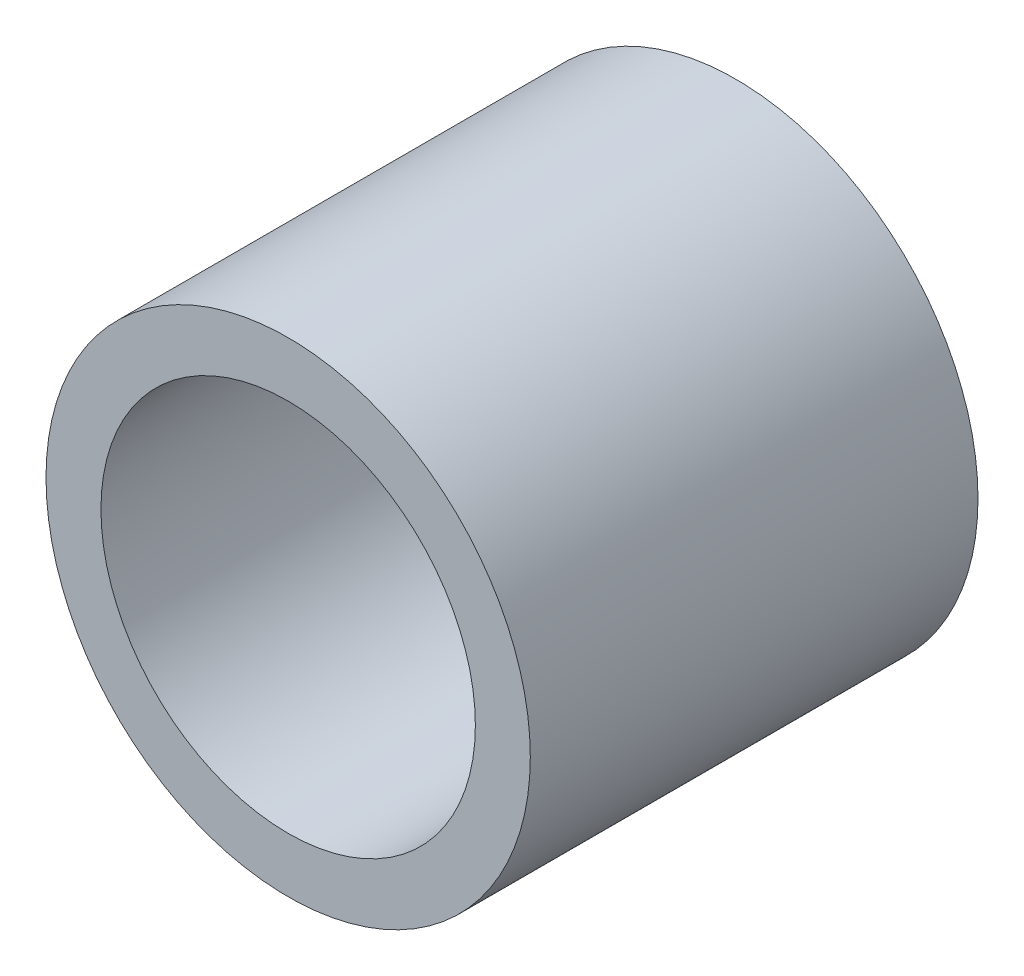
ISO-10303-21;
HEADER;
FILE_DESCRIPTION(('STEP AP214'),'2;1');
FILE_NAME('part.step','',(''),(''),'','','');
FILE_SCHEMA(('AUTOMOTIVE_DESIGN { 1 0 10303 214 1 1 1 1 }'));
ENDSEC;
DATA;
#1=APPLICATION_CONTEXT('core data for automotive mechanical design processes');
#2=APPLICATION_PROTOCOL_DEFINITION('international standard','automotive_design',2000,#1);
#3=PRODUCT_CONTEXT('',#1,'mechanical');
#4=PRODUCT('Part','Part','',(#3));
#5=PRODUCT_RELATED_PRODUCT_CATEGORY('part','',(#4));
#6=PRODUCT_DEFINITION_FORMATION('','',#4);
#7=PRODUCT_DEFINITION_CONTEXT('part definition',#1,'design');
#8=PRODUCT_DEFINITION('design','',#6,#7);
#9=PRODUCT_DEFINITION_SHAPE('','',#8);
#10=(LENGTH_UNIT() NAMED_UNIT(*) SI_UNIT(.MILLI.,.METRE.));
#11=(NAMED_UNIT(*) PLANE_ANGLE_UNIT() SI_UNIT($,.RADIAN.));
#12=(NAMED_UNIT(*) SI_UNIT($,.STERADIAN.) SOLID_ANGLE_UNIT());
#13=UNCERTAINTY_MEASURE_WITH_UNIT(LENGTH_MEASURE(1.E-05),#10,'distance_accuracy_value','');
#14=(GEOMETRIC_REPRESENTATION_CONTEXT(3) GLOBAL_UNCERTAINTY_ASSIGNED_CONTEXT((#13)) GLOBAL_UNIT_ASSIGNED_CONTEXT((#10,
#11,#12)) REPRESENTATION_CONTEXT('',''));
#15=CARTESIAN_POINT('',(0.,0.,0.));
#16=DIRECTION('',(0.,0.,1.));
#17=DIRECTION('',(1.,0.,0.));
#18=AXIS2_PLACEMENT_3D('',#15,#16,#17);
#19=CARTESIAN_POINT('',(0.,0.,0.));
#20=DIRECTION('',(0.,0.,1.));
#21=DIRECTION('',(1.,0.,0.));
#22=AXIS2_PLACEMENT_3D('',#19,#20,#21);
#23=CYLINDRICAL_SURFACE('',#22,4.6);
#24=CARTESIAN_POINT('',(0.,0.,0.));
#25=DIRECTION('',(0.,0.,1.));
#26=DIRECTION('',(1.,0.,0.));
#27=AXIS2_PLACEMENT_3D('',#24,#25,#26);
#28=CIRCLE('',#27,4.6);
#29=CARTESIAN_POINT('',(4.6,0.,0.));
#30=VERTEX_POINT('',#29);
#31=EDGE_CURVE('E26',#30,#30,#28,.T.);
#32=ORIENTED_EDGE('',*,*,#31,.F.);
#33=EDGE_LOOP('',(#32));
#34=FACE_BOUND('',#33,.T.);
#35=CARTESIAN_POINT('',(0.,0.,11.));
#36=DIRECTION('',(0.,0.,1.));
#37=DIRECTION('',(1.,0.,0.));
#38=AXIS2_PLACEMENT_3D('',#35,#36,#37);
#39=CIRCLE('',#38,4.6);
#40=CARTESIAN_POINT('',(4.6,0.,11.));
#41=VERTEX_POINT('',#40);
#42=EDGE_CURVE('E17',#41,#41,#39,.T.);
#43=ORIENTED_EDGE('',*,*,#42,.T.);
#44=EDGE_LOOP('',(#43));
#45=FACE_BOUND('',#44,.T.);
#46=ADVANCED_FACE('F14',(#34,#45),#23,.F.);
#47=CARTESIAN_POINT('',(0.,0.,11.));
#48=DIRECTION('',(0.,0.,-1.));
#49=DIRECTION('',(-1.,0.,0.));
#50=AXIS2_PLACEMENT_3D('',#47,#48,#49);
#51=PLANE('',#50);
#52=ORIENTED_EDGE('',*,*,#42,.F.);
#53=EDGE_LOOP('',(#52));
#54=FACE_BOUND('',#53,.T.);
#55=CARTESIAN_POINT('',(0.,0.,11.));
#56=DIRECTION('',(0.,0.,1.));
#57=DIRECTION('',(1.,0.,0.));
#58=AXIS2_PLACEMENT_3D('',#55,#56,#57);
#59=CIRCLE('',#58,5.95);
#60=CARTESIAN_POINT('',(5.95,0.,11.));
#61=VERTEX_POINT('',#60);
#62=EDGE_CURVE('E21',#61,#61,#59,.F.);
#63=ORIENTED_EDGE('',*,*,#62,.F.);
#64=EDGE_LOOP('',(#63));
#65=FACE_BOUND('',#64,.T.);
#66=ADVANCED_FACE('F35',(#54,#65),#51,.F.);
#67=CARTESIAN_POINT('',(0.,0.,0.));
#68=DIRECTION('',(0.,0.,-1.));
#69=DIRECTION('',(-1.,0.,0.));
#70=AXIS2_PLACEMENT_3D('',#67,#68,#69);
#71=PLANE('',#70);
#72=ORIENTED_EDGE('',*,*,#31,.T.);
#73=EDGE_LOOP('',(#72));
#74=FACE_BOUND('',#73,.T.);
#75=CARTESIAN_POINT('',(0.,0.,0.));
#76=DIRECTION('',(0.,0.,1.));
#77=DIRECTION('',(1.,0.,0.));
#78=AXIS2_PLACEMENT_3D('',#75,#76,#77);
#79=CIRCLE('',#78,5.95);
#80=CARTESIAN_POINT('',(5.95,0.,0.));
#81=VERTEX_POINT('',#80);
#82=EDGE_CURVE('E10',#81,#81,#79,.T.);
#83=ORIENTED_EDGE('',*,*,#82,.F.);
#84=EDGE_LOOP('',(#83));
#85=FACE_BOUND('',#84,.T.);
#86=ADVANCED_FACE('F38',(#74,#85),#71,.T.);
#87=CARTESIAN_POINT('',(0.,0.,0.));
#88=DIRECTION('',(0.,0.,1.));
#89=DIRECTION('',(1.,0.,0.));
#90=AXIS2_PLACEMENT_3D('',#87,#88,#89);
#91=CYLINDRICAL_SURFACE('',#90,5.95);
#92=ORIENTED_EDGE('',*,*,#82,.T.);
#93=EDGE_LOOP('',(#92));
#94=FACE_BOUND('',#93,.T.);
#95=ORIENTED_EDGE('',*,*,#62,.T.);
#96=EDGE_LOOP('',(#95));
#97=FACE_BOUND('',#96,.T.);
#98=ADVANCED_FACE('F41',(#94,#97),#91,.T.);
#99=CLOSED_SHELL('',(#46,#66,#86,#98));
#100=MANIFOLD_SOLID_BREP('B1',#99);
#101=ADVANCED_BREP_SHAPE_REPRESENTATION('',(#18,#100),#14);
#102=SHAPE_DEFINITION_REPRESENTATION(#9,#101);
ENDSEC;
END-ISO-10303-21;
